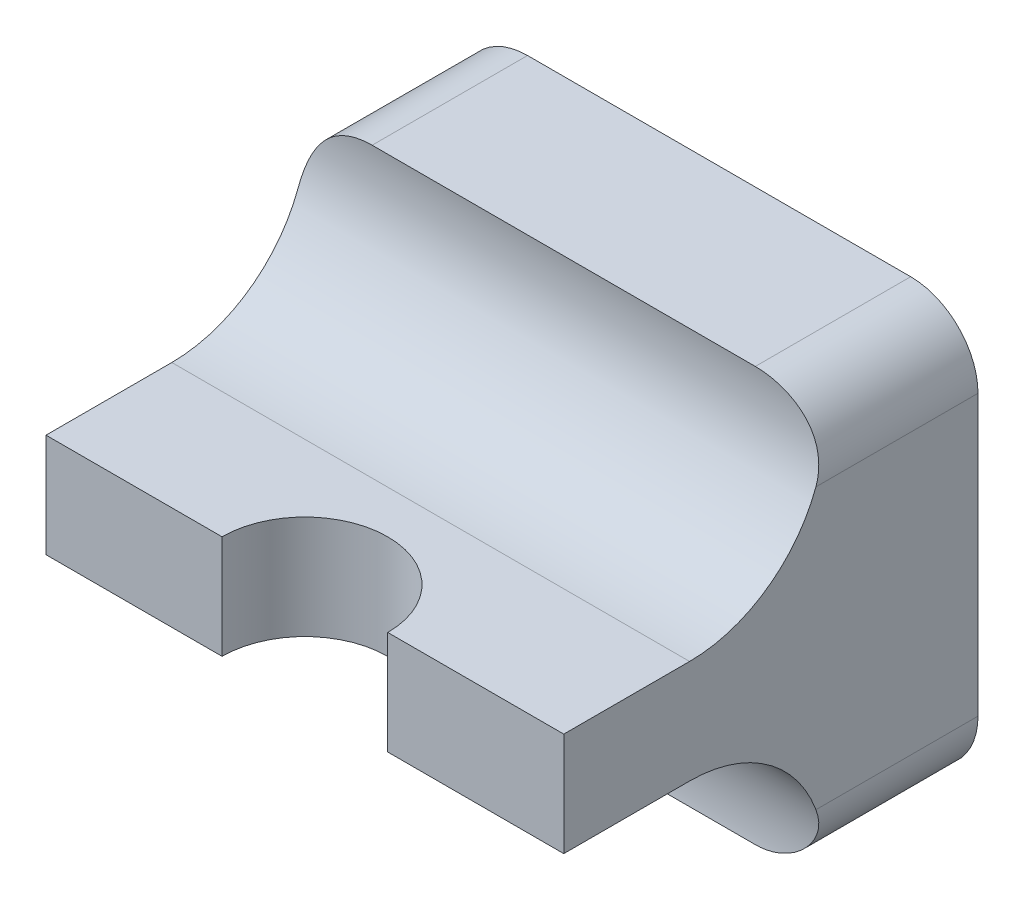
ISO-10303-21;
HEADER;
FILE_DESCRIPTION(('STEP AP214'),'2;1');
FILE_NAME('part.step','',(''),(''),'','','');
FILE_SCHEMA(('AUTOMOTIVE_DESIGN { 1 0 10303 214 1 1 1 1 }'));
ENDSEC;
DATA;
#1=APPLICATION_CONTEXT('core data for automotive mechanical design processes');
#2=APPLICATION_PROTOCOL_DEFINITION('international standard','automotive_design',2000,#1);
#3=PRODUCT_CONTEXT('',#1,'mechanical');
#4=PRODUCT('Part','Part','',(#3));
#5=PRODUCT_RELATED_PRODUCT_CATEGORY('part','',(#4));
#6=PRODUCT_DEFINITION_FORMATION('','',#4);
#7=PRODUCT_DEFINITION_CONTEXT('part definition',#1,'design');
#8=PRODUCT_DEFINITION('design','',#6,#7);
#9=PRODUCT_DEFINITION_SHAPE('','',#8);
#10=(LENGTH_UNIT() NAMED_UNIT(*) SI_UNIT(.MILLI.,.METRE.));
#11=(NAMED_UNIT(*) PLANE_ANGLE_UNIT() SI_UNIT($,.RADIAN.));
#12=(NAMED_UNIT(*) SI_UNIT($,.STERADIAN.) SOLID_ANGLE_UNIT());
#13=UNCERTAINTY_MEASURE_WITH_UNIT(LENGTH_MEASURE(1.E-05),#10,'distance_accuracy_value','');
#14=(GEOMETRIC_REPRESENTATION_CONTEXT(3) GLOBAL_UNCERTAINTY_ASSIGNED_CONTEXT((#13)) GLOBAL_UNIT_ASSIGNED_CONTEXT((#10,
#11,#12)) REPRESENTATION_CONTEXT('',''));
#15=CARTESIAN_POINT('',(0.,0.,0.));
#16=DIRECTION('',(0.,0.,1.));
#17=DIRECTION('',(1.,0.,0.));
#18=AXIS2_PLACEMENT_3D('',#15,#16,#17);
#19=CARTESIAN_POINT('',(0.,27.,40.));
#20=DIRECTION('',(0.,0.,1.));
#21=DIRECTION('',(1.,0.,0.));
#22=AXIS2_PLACEMENT_3D('',#19,#20,#21);
#23=PLANE('',#22);
#24=DIRECTION('',(0.,1.,0.));
#25=VECTOR('',#24,1.);
#26=CARTESIAN_POINT('',(-10.5,8.49999999999999,40.));
#27=LINE('',#26,#25);
#28=CARTESIAN_POINT('',(-10.5,8.49999999999999,40.));
#29=VERTEX_POINT('',#28);
#30=CARTESIAN_POINT('',(-10.5,18.5,40.));
#31=VERTEX_POINT('',#30);
#32=EDGE_CURVE('E49',#29,#31,#27,.T.);
#33=ORIENTED_EDGE('',*,*,#32,.F.);
#34=DIRECTION('',(1.,0.,0.));
#35=VECTOR('',#34,1.);
#36=CARTESIAN_POINT('',(-43.5,8.5,40.));
#37=LINE('',#36,#35);
#38=CARTESIAN_POINT('',(6.5,8.5,40.));
#39=VERTEX_POINT('',#38);
#40=EDGE_CURVE('E56',#29,#39,#37,.T.);
#41=ORIENTED_EDGE('',*,*,#40,.T.);
#42=DIRECTION('',(0.,1.,0.));
#43=VECTOR('',#42,1.);
#44=CARTESIAN_POINT('',(6.5,0.,40.));
#45=LINE('',#44,#43);
#46=CARTESIAN_POINT('',(6.5,18.5,40.));
#47=VERTEX_POINT('',#46);
#48=EDGE_CURVE('E300',#39,#47,#45,.T.);
#49=ORIENTED_EDGE('',*,*,#48,.T.);
#50=DIRECTION('',(1.,0.,0.));
#51=VECTOR('',#50,1.);
#52=CARTESIAN_POINT('',(-43.5,18.5,40.));
#53=LINE('',#52,#51);
#54=EDGE_CURVE('E222',#31,#47,#53,.T.);
#55=ORIENTED_EDGE('',*,*,#54,.F.);
#56=EDGE_LOOP('',(#33,#41,#49,#55));
#57=FACE_BOUND('',#56,.T.);
#58=ADVANCED_FACE('F33',(#57),#23,.T.);
#59=CARTESIAN_POINT('',(-43.5,0.,40.));
#60=DIRECTION('',(1.,0.,0.));
#61=DIRECTION('',(0.,0.,-1.));
#62=AXIS2_PLACEMENT_3D('',#59,#60,#61);
#63=PLANE('',#62);
#64=DIRECTION('',(0.,0.,1.));
#65=VECTOR('',#64,1.);
#66=CARTESIAN_POINT('',(-43.5,18.5,27.8501012715433));
#67=LINE('',#66,#65);
#68=CARTESIAN_POINT('',(-43.5,18.5,27.8501012715433));
#69=VERTEX_POINT('',#68);
#70=CARTESIAN_POINT('',(-43.5,18.5,40.));
#71=VERTEX_POINT('',#70);
#72=EDGE_CURVE('E226',#69,#71,#67,.T.);
#73=ORIENTED_EDGE('',*,*,#72,.F.);
#74=CARTESIAN_POINT('',(-43.5,31.5,27.8501012715433));
#75=DIRECTION('',(1.,0.,0.));
#76=DIRECTION('',(0.,0.,-1.));
#77=AXIS2_PLACEMENT_3D('',#74,#75,#76);
#78=CIRCLE('',#77,13.);
#79=CARTESIAN_POINT('',(-43.5,27.,15.6537903538928));
#80=VERTEX_POINT('',#79);
#81=EDGE_CURVE('E228',#69,#80,#78,.T.);
#82=ORIENTED_EDGE('',*,*,#81,.T.);
#83=DIRECTION('',(0.,0.,-1.));
#84=VECTOR('',#83,1.);
#85=CARTESIAN_POINT('',(-43.5,27.,40.));
#86=LINE('',#85,#84);
#87=CARTESIAN_POINT('',(-43.5,27.,0.));
#88=VERTEX_POINT('',#87);
#89=EDGE_CURVE('E264',#80,#88,#86,.T.);
#90=ORIENTED_EDGE('',*,*,#89,.T.);
#91=DIRECTION('',(0.,-1.,0.));
#92=VECTOR('',#91,1.);
#93=CARTESIAN_POINT('',(-43.5,0.,0.));
#94=LINE('',#93,#92);
#95=CARTESIAN_POINT('',(-43.5,0.,0.));
#96=VERTEX_POINT('',#95);
#97=EDGE_CURVE('E287',#88,#96,#94,.T.);
#98=ORIENTED_EDGE('',*,*,#97,.T.);
#99=DIRECTION('',(0.,0.,-1.));
#100=VECTOR('',#99,1.);
#101=CARTESIAN_POINT('',(-43.5,0.,40.));
#102=LINE('',#101,#100);
#103=CARTESIAN_POINT('',(-43.5,0.,15.6489216610147));
#104=VERTEX_POINT('',#103);
#105=EDGE_CURVE('E257',#104,#96,#102,.T.);
#106=ORIENTED_EDGE('',*,*,#105,.F.);
#107=CARTESIAN_POINT('',(-43.5,-4.5,27.8452325786651));
#108=DIRECTION('',(1.,0.,0.));
#109=DIRECTION('',(0.,0.,-1.));
#110=AXIS2_PLACEMENT_3D('',#107,#108,#109);
#111=CIRCLE('',#110,13.);
#112=CARTESIAN_POINT('',(-43.5,8.5,27.8452325786651));
#113=VERTEX_POINT('',#112);
#114=EDGE_CURVE('E163',#104,#113,#111,.T.);
#115=ORIENTED_EDGE('',*,*,#114,.T.);
#116=DIRECTION('',(0.,0.,1.));
#117=VECTOR('',#116,1.);
#118=CARTESIAN_POINT('',(-43.5,8.5,27.8452325786651));
#119=LINE('',#118,#117);
#120=CARTESIAN_POINT('',(-43.5,8.5,40.));
#121=VERTEX_POINT('',#120);
#122=EDGE_CURVE('E166',#113,#121,#119,.T.);
#123=ORIENTED_EDGE('',*,*,#122,.T.);
#124=DIRECTION('',(0.,-1.,0.));
#125=VECTOR('',#124,1.);
#126=CARTESIAN_POINT('',(-43.5,0.,40.));
#127=LINE('',#126,#125);
#128=EDGE_CURVE('E152',#71,#121,#127,.T.);
#129=ORIENTED_EDGE('',*,*,#128,.F.);
#130=EDGE_LOOP('',(#73,#82,#90,#98,#106,#115,#123,#129));
#131=FACE_BOUND('',#130,.T.);
#132=ADVANCED_FACE('F210',(#131),#63,.F.);
#133=CARTESIAN_POINT('',(6.5,0.,40.));
#134=DIRECTION('',(-1.,0.,0.));
#135=DIRECTION('',(0.,0.,1.));
#136=AXIS2_PLACEMENT_3D('',#133,#134,#135);
#137=PLANE('',#136);
#138=DIRECTION('',(0.,0.,1.));
#139=VECTOR('',#138,1.);
#140=CARTESIAN_POINT('',(6.5,18.5,27.8501012715433));
#141=LINE('',#140,#139);
#142=CARTESIAN_POINT('',(6.5,18.5,27.8501012715433));
#143=VERTEX_POINT('',#142);
#144=EDGE_CURVE('E165',#143,#47,#141,.T.);
#145=ORIENTED_EDGE('',*,*,#144,.T.);
#146=ORIENTED_EDGE('',*,*,#48,.F.);
#147=DIRECTION('',(0.,0.,1.));
#148=VECTOR('',#147,1.);
#149=CARTESIAN_POINT('',(6.5,8.5,27.8452325786651));
#150=LINE('',#149,#148);
#151=CARTESIAN_POINT('',(6.5,8.5,27.8452325786651));
#152=VERTEX_POINT('',#151);
#153=EDGE_CURVE('E160',#152,#39,#150,.T.);
#154=ORIENTED_EDGE('',*,*,#153,.F.);
#155=CARTESIAN_POINT('',(6.5,-4.5,27.8452325786651));
#156=DIRECTION('',(1.,0.,0.));
#157=DIRECTION('',(0.,0.,-1.));
#158=AXIS2_PLACEMENT_3D('',#155,#156,#157);
#159=CIRCLE('',#158,13.);
#160=CARTESIAN_POINT('',(6.5,0.,15.6489216610147));
#161=VERTEX_POINT('',#160);
#162=EDGE_CURVE('E162',#161,#152,#159,.T.);
#163=ORIENTED_EDGE('',*,*,#162,.F.);
#164=DIRECTION('',(0.,0.,-1.));
#165=VECTOR('',#164,1.);
#166=CARTESIAN_POINT('',(6.5,0.,40.));
#167=LINE('',#166,#165);
#168=CARTESIAN_POINT('',(6.5,0.,0.));
#169=VERTEX_POINT('',#168);
#170=EDGE_CURVE('E250',#161,#169,#167,.T.);
#171=ORIENTED_EDGE('',*,*,#170,.T.);
#172=DIRECTION('',(0.,1.,0.));
#173=VECTOR('',#172,1.);
#174=CARTESIAN_POINT('',(6.5,0.,0.));
#175=LINE('',#174,#173);
#176=CARTESIAN_POINT('',(6.5,27.,0.));
#177=VERTEX_POINT('',#176);
#178=EDGE_CURVE('E298',#169,#177,#175,.T.);
#179=ORIENTED_EDGE('',*,*,#178,.T.);
#180=DIRECTION('',(0.,0.,-1.));
#181=VECTOR('',#180,1.);
#182=CARTESIAN_POINT('',(6.5,27.,40.));
#183=LINE('',#182,#181);
#184=CARTESIAN_POINT('',(6.5,27.,15.6537903538928));
#185=VERTEX_POINT('',#184);
#186=EDGE_CURVE('E259',#185,#177,#183,.T.);
#187=ORIENTED_EDGE('',*,*,#186,.F.);
#188=CARTESIAN_POINT('',(6.5,31.5,27.8501012715433));
#189=DIRECTION('',(1.,0.,0.));
#190=DIRECTION('',(0.,0.,-1.));
#191=AXIS2_PLACEMENT_3D('',#188,#189,#190);
#192=CIRCLE('',#191,13.);
#193=EDGE_CURVE('E229',#143,#185,#192,.T.);
#194=ORIENTED_EDGE('',*,*,#193,.F.);
#195=EDGE_LOOP('',(#145,#146,#154,#163,#171,#179,#187,#194));
#196=FACE_BOUND('',#195,.T.);
#197=ADVANCED_FACE('F206',(#196),#137,.F.);
#198=DIRECTION('',(0.,1.,0.));
#199=VECTOR('',#198,1.);
#200=CARTESIAN_POINT('',(-26.5,8.49999999999999,40.));
#201=LINE('',#200,#199);
#202=CARTESIAN_POINT('',(-26.5,8.49999999999999,40.));
#203=VERTEX_POINT('',#202);
#204=CARTESIAN_POINT('',(-26.5,18.5,40.));
#205=VERTEX_POINT('',#204);
#206=EDGE_CURVE('E133',#203,#205,#201,.T.);
#207=ORIENTED_EDGE('',*,*,#206,.T.);
#208=EDGE_CURVE('E180',#71,#205,#53,.T.);
#209=ORIENTED_EDGE('',*,*,#208,.F.);
#210=ORIENTED_EDGE('',*,*,#128,.T.);
#211=EDGE_CURVE('E146',#121,#203,#37,.T.);
#212=ORIENTED_EDGE('',*,*,#211,.T.);
#213=EDGE_LOOP('',(#207,#209,#210,#212));
#214=FACE_BOUND('',#213,.T.);
#215=ADVANCED_FACE('F150',(#214),#23,.T.);
#216=CARTESIAN_POINT('',(0.,27.,40.));
#217=DIRECTION('',(0.,0.,-1.));
#218=DIRECTION('',(-1.,0.,0.));
#219=AXIS2_PLACEMENT_3D('',#216,#217,#218);
#220=CYLINDRICAL_SURFACE('',#219,6.5);
#221=DIRECTION('',(0.,0.,-1.));
#222=VECTOR('',#221,1.);
#223=CARTESIAN_POINT('',(0.,33.5,40.));
#224=LINE('',#223,#222);
#225=CARTESIAN_POINT('',(0.,33.5,15.0048686928782));
#226=VERTEX_POINT('',#225);
#227=CARTESIAN_POINT('',(0.,33.5,0.));
#228=VERTEX_POINT('',#227);
#229=EDGE_CURVE('E11',#226,#228,#224,.T.);
#230=ORIENTED_EDGE('',*,*,#229,.F.);
#231=CARTESIAN_POINT('',(0.,33.5,15.0048686928782));
#232=CARTESIAN_POINT('',(0.182314059006854,33.5000208870918,15.0049015596674));
#233=CARTESIAN_POINT('',(0.364621820062964,33.4923305152151,15.0036754433711));
#234=CARTESIAN_POINT('',(0.727896376361484,33.461680601435,14.9989436328582));
#235=CARTESIAN_POINT('',(0.908863344516548,33.4387230643502,14.9954382379481));
#236=CARTESIAN_POINT('',(1.26794287304748,33.377731776762,14.9863920277957));
#237=CARTESIAN_POINT('',(1.44605883932019,33.3397176704897,14.9808538653825));
#238=CARTESIAN_POINT('',(1.79842234645323,33.248901866025,14.9681970561091));
#239=CARTESIAN_POINT('',(1.97266985557518,33.1961000465568,14.9610783962871));
#240=CARTESIAN_POINT('',(2.31607936491392,33.0760892497208,14.9458541484115));
#241=CARTESIAN_POINT('',(2.48524150860153,33.0088806792392,14.9377485882334));
#242=CARTESIAN_POINT('',(2.81738351250256,32.8604987438631,14.9212724468548));
#243=CARTESIAN_POINT('',(2.98036118368465,32.7793204895623,14.9129017737042));
#244=CARTESIAN_POINT('',(3.29897010759086,32.6035613307246,14.8967257616713));
#245=CARTESIAN_POINT('',(3.45460075447411,32.5089793234693,14.8889204693825));
#246=CARTESIAN_POINT('',(3.75742450766109,32.3070593052686,14.8747826239916));
#247=CARTESIAN_POINT('',(3.90461775890699,32.1997215135463,14.8684500455846));
#248=CARTESIAN_POINT('',(4.19027474115448,31.9724324518847,14.8581879484485));
#249=CARTESIAN_POINT('',(4.32868899423401,31.8524183774153,14.8542711219597));
#250=CARTESIAN_POINT('',(4.59487873613379,31.601149148523,14.8498879431546));
#251=CARTESIAN_POINT('',(4.72265814741499,31.4698981751785,14.849420313041));
#252=CARTESIAN_POINT('',(4.96662283904101,31.1971563400789,14.8529140998662));
#253=CARTESIAN_POINT('',(5.08281205709543,31.0556689844625,14.856874006951));
#254=CARTESIAN_POINT('',(5.30273701164552,30.7635618307347,14.8701542185014));
#255=CARTESIAN_POINT('',(5.40647343871371,30.6129425397347,14.8794742255552));
#256=CARTESIAN_POINT('',(5.59711524420611,30.3095628658597,14.9038602792728));
#257=CARTESIAN_POINT('',(5.68449964053337,30.1570854215198,14.9187021666745));
#258=CARTESIAN_POINT('',(5.84637202682344,29.8461635814493,14.954780037461));
#259=CARTESIAN_POINT('',(5.92086087860784,29.6877195853314,14.9760155932909));
#260=CARTESIAN_POINT('',(6.056513985319,29.3662384052646,15.0253785637881));
#261=CARTESIAN_POINT('',(6.11767611205543,29.2032004923854,15.0535070776938));
#262=CARTESIAN_POINT('',(6.22639425061002,28.8740445192912,15.1169778145647));
#263=CARTESIAN_POINT('',(6.27395272228933,28.7079270217298,15.1523187313747));
#264=CARTESIAN_POINT('',(6.34600099932412,28.4127038318736,15.221325092449));
#265=CARTESIAN_POINT('',(6.37328204011534,28.283917753203,15.2534898474863));
#266=CARTESIAN_POINT('',(6.41984037705375,28.0260646753801,15.3221497164198));
#267=CARTESIAN_POINT('',(6.43911860569477,27.8969977107196,15.3586443251607));
#268=CARTESIAN_POINT('',(6.46977823005306,27.6393559319887,15.435856398602));
#269=CARTESIAN_POINT('',(6.4811684096879,27.5107807295538,15.476569107849));
#270=CARTESIAN_POINT('',(6.49628368400216,27.2545539408688,15.5621191486159));
#271=CARTESIAN_POINT('',(6.50000881238379,27.1269023505601,15.6069564619997));
#272=CARTESIAN_POINT('',(6.5,27.,15.6537903538928));
#273=B_SPLINE_CURVE_WITH_KNOTS('',3,(#231,#232,#233,#234,#235,#236,#237,#238,#239,#240,#241,
#242,#243,#244,#245,#246,#247,#248,#249,#250,#251,#252,#253,#254,#255,#256,#257,#258,#259,#260,
#261,#262,#263,#264,#265,#266,#267,#268,#269,#270,#271,#272),.UNSPECIFIED.,.F.,.F.,(4,2,2,2,2,2,
2,2,2,2,2,2,2,2,2,2,2,2,2,2,4),(0.,0.546766393797882,1.09346100276125,1.6394446791876,
2.18543283342903,2.73140556950231,3.27756978680955,3.82377896282128,4.3699787529422,
4.91902433408287,5.46786650431283,6.01652156852436,6.56514619286734,7.09357431079773,
7.62196709972584,8.15044420776397,8.67882569419987,9.08508267898866,9.49129231310504,
9.89704887265836,10.3028036481503),.UNSPECIFIED.);
#274=EDGE_CURVE('E308',#226,#185,#273,.T.);
#275=ORIENTED_EDGE('',*,*,#274,.T.);
#276=ORIENTED_EDGE('',*,*,#186,.T.);
#277=CARTESIAN_POINT('',(0.,27.,0.));
#278=DIRECTION('',(0.,0.,1.));
#279=DIRECTION('',(1.,0.,0.));
#280=AXIS2_PLACEMENT_3D('',#277,#278,#279);
#281=CIRCLE('',#280,6.5);
#282=EDGE_CURVE('E283',#177,#228,#281,.T.);
#283=ORIENTED_EDGE('',*,*,#282,.T.);
#284=EDGE_LOOP('',(#230,#275,#276,#283));
#285=FACE_BOUND('',#284,.T.);
#286=ADVANCED_FACE('F35',(#285),#220,.T.);
#287=CARTESIAN_POINT('',(-37.,33.5,40.));
#288=DIRECTION('',(0.,-1.,0.));
#289=DIRECTION('',(0.,0.,-1.));
#290=AXIS2_PLACEMENT_3D('',#287,#288,#289);
#291=PLANE('',#290);
#292=DIRECTION('',(0.,0.,-1.));
#293=VECTOR('',#292,1.);
#294=CARTESIAN_POINT('',(-37.,33.5,40.));
#295=LINE('',#294,#293);
#296=CARTESIAN_POINT('',(-37.,33.5,15.0048686928782));
#297=VERTEX_POINT('',#296);
#298=CARTESIAN_POINT('',(-37.,33.5,0.));
#299=VERTEX_POINT('',#298);
#300=EDGE_CURVE('E42',#297,#299,#295,.T.);
#301=ORIENTED_EDGE('',*,*,#300,.F.);
#302=DIRECTION('',(1.,0.,0.));
#303=VECTOR('',#302,1.);
#304=CARTESIAN_POINT('',(-43.5,33.5,15.0048686928782));
#305=LINE('',#304,#303);
#306=EDGE_CURVE('E236',#297,#226,#305,.T.);
#307=ORIENTED_EDGE('',*,*,#306,.T.);
#308=ORIENTED_EDGE('',*,*,#229,.T.);
#309=DIRECTION('',(-1.,0.,0.));
#310=VECTOR('',#309,1.);
#311=CARTESIAN_POINT('',(-37.,33.5,0.));
#312=LINE('',#311,#310);
#313=EDGE_CURVE('E278',#228,#299,#312,.T.);
#314=ORIENTED_EDGE('',*,*,#313,.T.);
#315=EDGE_LOOP('',(#301,#307,#308,#314));
#316=FACE_BOUND('',#315,.T.);
#317=ADVANCED_FACE('F279',(#316),#291,.F.);
#318=CARTESIAN_POINT('',(-37.,27.,40.));
#319=DIRECTION('',(0.,0.,-1.));
#320=DIRECTION('',(-1.,0.,0.));
#321=AXIS2_PLACEMENT_3D('',#318,#319,#320);
#322=CYLINDRICAL_SURFACE('',#321,6.5);
#323=ORIENTED_EDGE('',*,*,#89,.F.);
#324=CARTESIAN_POINT('',(-43.5,27.,15.6537903538928));
#325=CARTESIAN_POINT('',(-43.5000240004598,27.1598813554865,15.5947699845186));
#326=CARTESIAN_POINT('',(-43.4941013212244,27.320969898346,15.5389352182182));
#327=CARTESIAN_POINT('',(-43.4700039203278,27.6444187593368,15.433852974099));
#328=CARTESIAN_POINT('',(-43.451825856808,27.8067794124147,15.3846072974165));
#329=CARTESIAN_POINT('',(-43.4028867256845,28.1313548496404,15.2930044081244));
#330=CARTESIAN_POINT('',(-43.3721401356079,28.2935695871211,15.2506393480145));
#331=CARTESIAN_POINT('',(-43.2979135254488,28.6167122255945,15.1727886301813));
#332=CARTESIAN_POINT('',(-43.2544351356261,28.7776402886327,15.1373020926548));
#333=CARTESIAN_POINT('',(-43.1546478685411,29.0972350806398,15.0730378053538));
#334=CARTESIAN_POINT('',(-43.0983114475749,29.2558961666521,15.0442747298779));
#335=CARTESIAN_POINT('',(-42.9730555488697,29.5692565601882,14.9932964156333));
#336=CARTESIAN_POINT('',(-42.9041357939872,29.7239557803676,14.9710813211097));
#337=CARTESIAN_POINT('',(-42.7541120071313,30.0280228543402,14.9327967316101));
#338=CARTESIAN_POINT('',(-42.6730137298387,30.1773931851411,14.9167243466863));
#339=CARTESIAN_POINT('',(-42.4991189585318,30.4696701659417,14.890164597585));
#340=CARTESIAN_POINT('',(-42.4063226571399,30.6125769223196,14.8796771414596));
#341=CARTESIAN_POINT('',(-42.2110225954613,30.8888886500402,14.8637459714522));
#342=CARTESIAN_POINT('',(-42.1086732067471,31.0223987612937,14.8582335930203));
#343=CARTESIAN_POINT('',(-41.8938688569936,31.2811638649446,14.8512980276064));
#344=CARTESIAN_POINT('',(-41.7814104846949,31.4064160458149,14.8498762263653));
#345=CARTESIAN_POINT('',(-41.429929427629,31.7685130758144,14.8506361945254));
#346=CARTESIAN_POINT('',(-41.1767122849027,31.9918234609628,14.8578375284853));
#347=CARTESIAN_POINT('',(-40.6253388775782,32.4066517672491,14.8800000283357));
#348=CARTESIAN_POINT('',(-40.3255576856465,32.595991106951,14.8953351616542));
#349=CARTESIAN_POINT('',(-39.8561778756594,32.841537439479,14.9192472869094));
#350=CARTESIAN_POINT('',(-39.6963534190974,32.9170022139249,14.927373604344));
#351=CARTESIAN_POINT('',(-39.3710948453145,33.0546713583414,14.9432111295253));
#352=CARTESIAN_POINT('',(-39.2056628479934,33.1168806760672,14.9509224913529));
#353=CARTESIAN_POINT('',(-38.8740804684264,33.2263648495908,14.9651238524562));
#354=CARTESIAN_POINT('',(-38.7080325869554,33.2739480528913,14.971637703111));
#355=CARTESIAN_POINT('',(-38.3726267853055,33.3557604881714,14.9831727101627));
#356=CARTESIAN_POINT('',(-38.2032689415133,33.3899900279431,14.9881939009635));
#357=CARTESIAN_POINT('',(-37.8621675422592,33.4448832526631,14.9963762951471));
#358=CARTESIAN_POINT('',(-37.6904219768518,33.4655347007157,14.9995358204876));
#359=CARTESIAN_POINT('',(-37.3457861273294,33.4931022947271,15.0037954506085));
#360=CARTESIAN_POINT('',(-37.1728957048704,33.5000167491626,15.004895301767));
#361=CARTESIAN_POINT('',(-37.,33.5,15.0048686928782));
#362=B_SPLINE_CURVE_WITH_KNOTS('',3,(#324,#325,#326,#327,#328,#329,#330,#331,#332,#333,#334,
#335,#336,#337,#338,#339,#340,#341,#342,#343,#344,#345,#346,#347,#348,#349,#350,#351,#352,#353,
#354,#355,#356,#357,#358,#359,#360,#361),.UNSPECIFIED.,.F.,.F.,(4,2,2,2,2,2,2,2,2,2,2,2,2,2,2,2,
2,2,4),(0.,0.511188498286385,1.02251644637845,1.53325705456603,2.04393229288538,
2.55571191073704,3.06750280171358,3.57905261423139,4.09059400454777,4.59496221652504,
5.09950127024535,6.10812482119801,7.16775000087518,7.6980618938759,8.22817549362204,
8.74619458617742,9.26420173806788,9.78267509260811,10.3012122861065),.UNSPECIFIED.);
#363=EDGE_CURVE('E275',#80,#297,#362,.T.);
#364=ORIENTED_EDGE('',*,*,#363,.T.);
#365=ORIENTED_EDGE('',*,*,#300,.T.);
#366=CARTESIAN_POINT('',(-37.,27.,0.));
#367=DIRECTION('',(0.,0.,1.));
#368=DIRECTION('',(1.,0.,0.));
#369=AXIS2_PLACEMENT_3D('',#366,#367,#368);
#370=CIRCLE('',#369,6.5);
#371=EDGE_CURVE('E273',#299,#88,#370,.T.);
#372=ORIENTED_EDGE('',*,*,#371,.T.);
#373=EDGE_LOOP('',(#323,#364,#365,#372));
#374=FACE_BOUND('',#373,.T.);
#375=ADVANCED_FACE('F271',(#374),#322,.T.);
#376=CARTESIAN_POINT('',(-37.,0.,40.));
#377=DIRECTION('',(0.,0.,-1.));
#378=DIRECTION('',(-1.,0.,0.));
#379=AXIS2_PLACEMENT_3D('',#376,#377,#378);
#380=CYLINDRICAL_SURFACE('',#379,6.5);
#381=DIRECTION('',(0.,0.,-1.));
#382=VECTOR('',#381,1.);
#383=CARTESIAN_POINT('',(-37.,-6.5,40.));
#384=LINE('',#383,#382);
#385=CARTESIAN_POINT('',(-37.,-6.5,15.));
#386=VERTEX_POINT('',#385);
#387=CARTESIAN_POINT('',(-37.,-6.5,0.));
#388=VERTEX_POINT('',#387);
#389=EDGE_CURVE('E255',#386,#388,#384,.T.);
#390=ORIENTED_EDGE('',*,*,#389,.F.);
#391=CARTESIAN_POINT('',(-37.,-6.5,15.));
#392=CARTESIAN_POINT('',(-37.1823140590068,-6.50002088709183,15.0000328667892));
#393=CARTESIAN_POINT('',(-37.364621820063,-6.49233051521506,14.9988067504929));
#394=CARTESIAN_POINT('',(-37.7278963763615,-6.46168060143503,14.9940749399801));
#395=CARTESIAN_POINT('',(-37.9088633445165,-6.43872306435016,14.9905695450699));
#396=CARTESIAN_POINT('',(-38.2679428730475,-6.37773177676201,14.9815233349176));
#397=CARTESIAN_POINT('',(-38.4460588393202,-6.33971767048967,14.9759851725044));
#398=CARTESIAN_POINT('',(-38.7984223464532,-6.24890186602504,14.9633283632309));
#399=CARTESIAN_POINT('',(-38.9726698555752,-6.19610004655677,14.9562097034089));
#400=CARTESIAN_POINT('',(-39.3160793649139,-6.0760892497208,14.9409854555333));
#401=CARTESIAN_POINT('',(-39.4852415086015,-6.00888067923917,14.9328798953553));
#402=CARTESIAN_POINT('',(-39.8173835125026,-5.86049874386315,14.9164037539766));
#403=CARTESIAN_POINT('',(-39.9803611836846,-5.77932048956225,14.908033080826));
#404=CARTESIAN_POINT('',(-40.2989701075909,-5.60356133072458,14.8918570687932));
#405=CARTESIAN_POINT('',(-40.4546007544741,-5.50897932346935,14.8840517765044));
#406=CARTESIAN_POINT('',(-40.7574245076611,-5.30705930526861,14.8699139311134));
#407=CARTESIAN_POINT('',(-40.904617758907,-5.19972151354627,14.8635813527064));
#408=CARTESIAN_POINT('',(-41.1902747411545,-4.97243245188471,14.8533192555703));
#409=CARTESIAN_POINT('',(-41.328688994234,-4.85241837741525,14.8494024290815));
#410=CARTESIAN_POINT('',(-41.5948787361338,-4.601149148523,14.8450192502764));
#411=CARTESIAN_POINT('',(-41.722658147415,-4.46989817517849,14.8445516201628));
#412=CARTESIAN_POINT('',(-41.966622839041,-4.19715634007889,14.848045406988));
#413=CARTESIAN_POINT('',(-42.0828120570954,-4.05566898446251,14.8520053140728));
#414=CARTESIAN_POINT('',(-42.3027370116455,-3.76356183073468,14.8652855256232));
#415=CARTESIAN_POINT('',(-42.4064734387137,-3.61294253973473,14.8746055326771));
#416=CARTESIAN_POINT('',(-42.5971152442061,-3.30956286585967,14.8989915863947));
#417=CARTESIAN_POINT('',(-42.6844996405334,-3.15708542151982,14.9138334737963));
#418=CARTESIAN_POINT('',(-42.8463720268234,-2.84616358144931,14.9499113445828));
#419=CARTESIAN_POINT('',(-42.9208608786078,-2.68771958533136,14.9711469004127));
#420=CARTESIAN_POINT('',(-43.056513985319,-2.36623840526461,15.0205098709099));
#421=CARTESIAN_POINT('',(-43.1176761120554,-2.20320049238537,15.0486383848156));
#422=CARTESIAN_POINT('',(-43.22639425061,-1.87404451929125,15.1121091216865));
#423=CARTESIAN_POINT('',(-43.2739527222893,-1.70792702172977,15.1474500384965));
#424=CARTESIAN_POINT('',(-43.3460009993241,-1.41270383187356,15.2164563995708));
#425=CARTESIAN_POINT('',(-43.3732820401153,-1.28391775320298,15.2486211546081));
#426=CARTESIAN_POINT('',(-43.4198403770538,-1.02606467538012,15.3172810235417));
#427=CARTESIAN_POINT('',(-43.4391186056948,-0.896997710719634,15.3537756322825));
#428=CARTESIAN_POINT('',(-43.4697782300531,-0.639355931988734,15.4309877057238));
#429=CARTESIAN_POINT('',(-43.4811684096879,-0.51078072955384,15.4717004149708));
#430=CARTESIAN_POINT('',(-43.4962836840022,-0.254553940868815,15.5572504557378));
#431=CARTESIAN_POINT('',(-43.5000088123838,-0.126902350560143,15.6020877691215));
#432=CARTESIAN_POINT('',(-43.5,0.,15.6489216610147));
#433=B_SPLINE_CURVE_WITH_KNOTS('',3,(#391,#392,#393,#394,#395,#396,#397,#398,#399,#400,#401,
#402,#403,#404,#405,#406,#407,#408,#409,#410,#411,#412,#413,#414,#415,#416,#417,#418,#419,#420,
#421,#422,#423,#424,#425,#426,#427,#428,#429,#430,#431,#432),.UNSPECIFIED.,.F.,.F.,(4,2,2,2,2,2,
2,2,2,2,2,2,2,2,2,2,2,2,2,2,4),(0.,0.54676639379788,1.09346100276125,1.63944467918759,
2.18543283342902,2.73140556950231,3.27756978680954,3.82377896282127,4.36997875294219,
4.91902433408286,5.46786650431283,6.01652156852436,6.56514619286733,7.09357431079773,
7.62196709972583,8.15044420776397,8.67882569419987,9.08508267898866,9.49129231310503,
9.89704887265836,10.3028036481503),.UNSPECIFIED.);
#434=EDGE_CURVE('E179',#386,#104,#433,.T.);
#435=ORIENTED_EDGE('',*,*,#434,.T.);
#436=ORIENTED_EDGE('',*,*,#105,.T.);
#437=CARTESIAN_POINT('',(-37.,0.,0.));
#438=DIRECTION('',(0.,0.,1.));
#439=DIRECTION('',(1.,0.,0.));
#440=AXIS2_PLACEMENT_3D('',#437,#438,#439);
#441=CIRCLE('',#440,6.5);
#442=EDGE_CURVE('E289',#96,#388,#441,.T.);
#443=ORIENTED_EDGE('',*,*,#442,.T.);
#444=EDGE_LOOP('',(#390,#435,#436,#443));
#445=FACE_BOUND('',#444,.T.);
#446=ADVANCED_FACE('F337',(#445),#380,.T.);
#447=CARTESIAN_POINT('',(-37.,-6.5,40.));
#448=DIRECTION('',(0.,1.,0.));
#449=DIRECTION('',(0.,0.,1.));
#450=AXIS2_PLACEMENT_3D('',#447,#448,#449);
#451=PLANE('',#450);
#452=DIRECTION('',(0.,0.,-1.));
#453=VECTOR('',#452,1.);
#454=CARTESIAN_POINT('',(0.,-6.5,40.));
#455=LINE('',#454,#453);
#456=CARTESIAN_POINT('',(0.,-6.5,15.));
#457=VERTEX_POINT('',#456);
#458=CARTESIAN_POINT('',(0.,-6.5,0.));
#459=VERTEX_POINT('',#458);
#460=EDGE_CURVE('E248',#457,#459,#455,.T.);
#461=ORIENTED_EDGE('',*,*,#460,.F.);
#462=DIRECTION('',(1.,0.,0.));
#463=VECTOR('',#462,1.);
#464=CARTESIAN_POINT('',(-43.5,-6.5,15.));
#465=LINE('',#464,#463);
#466=EDGE_CURVE('E156',#386,#457,#465,.T.);
#467=ORIENTED_EDGE('',*,*,#466,.F.);
#468=ORIENTED_EDGE('',*,*,#389,.T.);
#469=DIRECTION('',(1.,0.,0.));
#470=VECTOR('',#469,1.);
#471=CARTESIAN_POINT('',(-37.,-6.5,0.));
#472=LINE('',#471,#470);
#473=EDGE_CURVE('E253',#388,#459,#472,.T.);
#474=ORIENTED_EDGE('',*,*,#473,.T.);
#475=EDGE_LOOP('',(#461,#467,#468,#474));
#476=FACE_BOUND('',#475,.T.);
#477=ADVANCED_FACE('F251',(#476),#451,.F.);
#478=CARTESIAN_POINT('',(0.,0.,40.));
#479=DIRECTION('',(0.,0.,-1.));
#480=DIRECTION('',(-1.,0.,0.));
#481=AXIS2_PLACEMENT_3D('',#478,#479,#480);
#482=CYLINDRICAL_SURFACE('',#481,6.5);
#483=ORIENTED_EDGE('',*,*,#170,.F.);
#484=CARTESIAN_POINT('',(6.5,0.,15.6489216610147));
#485=CARTESIAN_POINT('',(6.50002400045981,-0.159881355486486,15.5899012916404));
#486=CARTESIAN_POINT('',(6.49410132122442,-0.320969898345956,15.53406652534));
#487=CARTESIAN_POINT('',(6.47000392032778,-0.644418759336817,15.4289842812209));
#488=CARTESIAN_POINT('',(6.45182585680802,-0.806779412414722,15.3797386045384));
#489=CARTESIAN_POINT('',(6.40288672568448,-1.13135484964042,15.2881357152462));
#490=CARTESIAN_POINT('',(6.37214013560791,-1.29356958712107,15.2457706551363));
#491=CARTESIAN_POINT('',(6.2979135254488,-1.61671222559454,15.1679199373031));
#492=CARTESIAN_POINT('',(6.25443513562608,-1.77764028863268,15.1324333997766));
#493=CARTESIAN_POINT('',(6.1546478685411,-2.09723508063979,15.0681691124756));
#494=CARTESIAN_POINT('',(6.09831144757493,-2.25589616665212,15.0394060369997));
#495=CARTESIAN_POINT('',(5.97305554886974,-2.56925656018818,14.9884277227551));
#496=CARTESIAN_POINT('',(5.90413579398724,-2.72395578036764,14.9662126282315));
#497=CARTESIAN_POINT('',(5.7541120071313,-3.02802285434024,14.9279280387319));
#498=CARTESIAN_POINT('',(5.67301372983873,-3.17739318514112,14.9118556538081));
#499=CARTESIAN_POINT('',(5.49911895853178,-3.46967016594173,14.8852959047069));
#500=CARTESIAN_POINT('',(5.40632265713987,-3.61257692231959,14.8748084485815));
#501=CARTESIAN_POINT('',(5.2110225954613,-3.88888865004023,14.858877278574));
#502=CARTESIAN_POINT('',(5.1086732067471,-4.02239876129375,14.8533649001421));
#503=CARTESIAN_POINT('',(4.89386885699362,-4.28116386494461,14.8464293347283));
#504=CARTESIAN_POINT('',(4.78141048469493,-4.40641604581486,14.8450075334871));
#505=CARTESIAN_POINT('',(4.42992942762898,-4.76851307581445,14.8457675016472));
#506=CARTESIAN_POINT('',(4.17671228490275,-4.99182346096284,14.8529688356072));
#507=CARTESIAN_POINT('',(3.62533887757818,-5.40665176724915,14.8751313354575));
#508=CARTESIAN_POINT('',(3.32555768564646,-5.59599110695096,14.890466468776));
#509=CARTESIAN_POINT('',(2.85617787565935,-5.84153743947898,14.9143785940312));
#510=CARTESIAN_POINT('',(2.69635341909739,-5.91700221392489,14.9225049114658));
#511=CARTESIAN_POINT('',(2.37109484531445,-6.05467135834144,14.9383424366471));
#512=CARTESIAN_POINT('',(2.20566284799337,-6.11688067606722,14.9460537984748));
#513=CARTESIAN_POINT('',(1.87408046842639,-6.22636484959076,14.960255159578));
#514=CARTESIAN_POINT('',(1.70803258695537,-6.27394805289131,14.9667690102328));
#515=CARTESIAN_POINT('',(1.37262678530548,-6.35576048817144,14.9783040172845));
#516=CARTESIAN_POINT('',(1.20326894151329,-6.38999002794314,14.9833252080853));
#517=CARTESIAN_POINT('',(0.862167542259177,-6.44488325266311,14.9915076022689));
#518=CARTESIAN_POINT('',(0.690421976851806,-6.46553470071572,14.9946671276094));
#519=CARTESIAN_POINT('',(0.34578612732938,-6.49310229472708,14.9989267577303));
#520=CARTESIAN_POINT('',(0.17289570487036,-6.50001674916262,15.0000266088889));
#521=CARTESIAN_POINT('',(0.,-6.5,15.));
#522=B_SPLINE_CURVE_WITH_KNOTS('',3,(#484,#485,#486,#487,#488,#489,#490,#491,#492,#493,#494,
#495,#496,#497,#498,#499,#500,#501,#502,#503,#504,#505,#506,#507,#508,#509,#510,#511,#512,#513,
#514,#515,#516,#517,#518,#519,#520,#521),.UNSPECIFIED.,.F.,.F.,(4,2,2,2,2,2,2,2,2,2,2,2,2,2,2,2,
2,2,4),(0.,0.511188498286389,1.02251644637845,1.53325705456603,2.04393229288539,
2.55571191073705,3.06750280171359,3.57905261423139,4.09059400454778,4.59496221652505,
5.09950127024536,6.10812482119803,7.16775000087519,7.69806189387592,8.22817549362204,
8.74619458617743,9.26420173806788,9.78267509260811,10.3012122861065),.UNSPECIFIED.);
#523=EDGE_CURVE('E170',#161,#457,#522,.T.);
#524=ORIENTED_EDGE('',*,*,#523,.T.);
#525=ORIENTED_EDGE('',*,*,#460,.T.);
#526=CARTESIAN_POINT('',(0.,0.,0.));
#527=DIRECTION('',(0.,0.,1.));
#528=DIRECTION('',(1.,0.,0.));
#529=AXIS2_PLACEMENT_3D('',#526,#527,#528);
#530=CIRCLE('',#529,6.5);
#531=EDGE_CURVE('E296',#459,#169,#530,.T.);
#532=ORIENTED_EDGE('',*,*,#531,.T.);
#533=EDGE_LOOP('',(#483,#524,#525,#532));
#534=FACE_BOUND('',#533,.T.);
#535=ADVANCED_FACE('F187',(#534),#482,.T.);
#536=CARTESIAN_POINT('',(0.,27.,0.));
#537=DIRECTION('',(0.,0.,1.));
#538=DIRECTION('',(1.,0.,0.));
#539=AXIS2_PLACEMENT_3D('',#536,#537,#538);
#540=PLANE('',#539);
#541=ORIENTED_EDGE('',*,*,#282,.F.);
#542=ORIENTED_EDGE('',*,*,#178,.F.);
#543=ORIENTED_EDGE('',*,*,#531,.F.);
#544=ORIENTED_EDGE('',*,*,#473,.F.);
#545=ORIENTED_EDGE('',*,*,#442,.F.);
#546=ORIENTED_EDGE('',*,*,#97,.F.);
#547=ORIENTED_EDGE('',*,*,#371,.F.);
#548=ORIENTED_EDGE('',*,*,#313,.F.);
#549=EDGE_LOOP('',(#541,#542,#543,#544,#545,#546,#547,#548));
#550=FACE_BOUND('',#549,.T.);
#551=ADVANCED_FACE('F196',(#550),#540,.F.);
#552=CARTESIAN_POINT('',(-43.5,-4.5,27.8452325786651));
#553=DIRECTION('',(1.,0.,0.));
#554=DIRECTION('',(0.,0.,-1.));
#555=AXIS2_PLACEMENT_3D('',#552,#553,#554);
#556=CYLINDRICAL_SURFACE('',#555,13.);
#557=ORIENTED_EDGE('',*,*,#466,.T.);
#558=ORIENTED_EDGE('',*,*,#523,.F.);
#559=ORIENTED_EDGE('',*,*,#162,.T.);
#560=DIRECTION('',(1.,0.,0.));
#561=VECTOR('',#560,1.);
#562=CARTESIAN_POINT('',(-43.5,8.5,27.8452325786651));
#563=LINE('',#562,#561);
#564=EDGE_CURVE('E153',#113,#152,#563,.T.);
#565=ORIENTED_EDGE('',*,*,#564,.F.);
#566=ORIENTED_EDGE('',*,*,#114,.F.);
#567=ORIENTED_EDGE('',*,*,#434,.F.);
#568=EDGE_LOOP('',(#557,#558,#559,#565,#566,#567));
#569=FACE_BOUND('',#568,.T.);
#570=ADVANCED_FACE('F191',(#569),#556,.F.);
#571=CARTESIAN_POINT('',(-43.5,8.5,27.8452325786651));
#572=DIRECTION('',(0.,1.,0.));
#573=DIRECTION('',(0.,0.,1.));
#574=AXIS2_PLACEMENT_3D('',#571,#572,#573);
#575=PLANE('',#574);
#576=ORIENTED_EDGE('',*,*,#40,.F.);
#577=CARTESIAN_POINT('',(-18.5,8.49999999999999,40.));
#578=DIRECTION('',(0.,1.,0.));
#579=DIRECTION('',(0.,0.,1.));
#580=AXIS2_PLACEMENT_3D('',#577,#578,#579);
#581=CIRCLE('',#580,8.);
#582=EDGE_CURVE('E136',#29,#203,#581,.T.);
#583=ORIENTED_EDGE('',*,*,#582,.T.);
#584=ORIENTED_EDGE('',*,*,#211,.F.);
#585=ORIENTED_EDGE('',*,*,#122,.F.);
#586=ORIENTED_EDGE('',*,*,#564,.T.);
#587=ORIENTED_EDGE('',*,*,#153,.T.);
#588=EDGE_LOOP('',(#576,#583,#584,#585,#586,#587));
#589=FACE_BOUND('',#588,.T.);
#590=ADVANCED_FACE('F144',(#589),#575,.F.);
#591=CARTESIAN_POINT('',(-43.5,31.5,27.8501012715433));
#592=DIRECTION('',(1.,0.,0.));
#593=DIRECTION('',(0.,0.,-1.));
#594=AXIS2_PLACEMENT_3D('',#591,#592,#593);
#595=CYLINDRICAL_SURFACE('',#594,13.);
#596=ORIENTED_EDGE('',*,*,#306,.F.);
#597=ORIENTED_EDGE('',*,*,#363,.F.);
#598=ORIENTED_EDGE('',*,*,#81,.F.);
#599=DIRECTION('',(1.,0.,0.));
#600=VECTOR('',#599,1.);
#601=CARTESIAN_POINT('',(-43.5,18.5,27.8501012715433));
#602=LINE('',#601,#600);
#603=EDGE_CURVE('E232',#69,#143,#602,.T.);
#604=ORIENTED_EDGE('',*,*,#603,.T.);
#605=ORIENTED_EDGE('',*,*,#193,.T.);
#606=ORIENTED_EDGE('',*,*,#274,.F.);
#607=EDGE_LOOP('',(#596,#597,#598,#604,#605,#606));
#608=FACE_BOUND('',#607,.T.);
#609=ADVANCED_FACE('F203',(#608),#595,.F.);
#610=CARTESIAN_POINT('',(-43.5,18.5,27.8501012715433));
#611=DIRECTION('',(0.,1.,0.));
#612=DIRECTION('',(0.,0.,1.));
#613=AXIS2_PLACEMENT_3D('',#610,#611,#612);
#614=PLANE('',#613);
#615=CARTESIAN_POINT('',(-18.5,18.5,40.));
#616=DIRECTION('',(0.,1.,0.));
#617=DIRECTION('',(0.,0.,1.));
#618=AXIS2_PLACEMENT_3D('',#615,#616,#617);
#619=CIRCLE('',#618,8.);
#620=EDGE_CURVE('E137',#31,#205,#619,.T.);
#621=ORIENTED_EDGE('',*,*,#620,.F.);
#622=ORIENTED_EDGE('',*,*,#54,.T.);
#623=ORIENTED_EDGE('',*,*,#144,.F.);
#624=ORIENTED_EDGE('',*,*,#603,.F.);
#625=ORIENTED_EDGE('',*,*,#72,.T.);
#626=ORIENTED_EDGE('',*,*,#208,.T.);
#627=EDGE_LOOP('',(#621,#622,#623,#624,#625,#626));
#628=FACE_BOUND('',#627,.T.);
#629=ADVANCED_FACE('F198',(#628),#614,.T.);
#630=CARTESIAN_POINT('',(-18.5,8.49999999999999,40.));
#631=DIRECTION('',(0.,1.,0.));
#632=DIRECTION('',(0.,0.,1.));
#633=AXIS2_PLACEMENT_3D('',#630,#631,#632);
#634=CYLINDRICAL_SURFACE('',#633,8.);
#635=ORIENTED_EDGE('',*,*,#620,.T.);
#636=ORIENTED_EDGE('',*,*,#206,.F.);
#637=ORIENTED_EDGE('',*,*,#582,.F.);
#638=ORIENTED_EDGE('',*,*,#32,.T.);
#639=EDGE_LOOP('',(#635,#636,#637,#638));
#640=FACE_BOUND('',#639,.T.);
#641=ADVANCED_FACE('F135',(#640),#634,.F.);
#642=CLOSED_SHELL('',(#58,#132,#197,#215,#286,#317,#375,#446,#477,#535,#551,#570,#590,#609,#629,#641));
#643=MANIFOLD_SOLID_BREP('B2',#642);
#644=ADVANCED_BREP_SHAPE_REPRESENTATION('',(#18,#643),#14);
#645=SHAPE_DEFINITION_REPRESENTATION(#9,#644);
ENDSEC;
END-ISO-10303-21;
